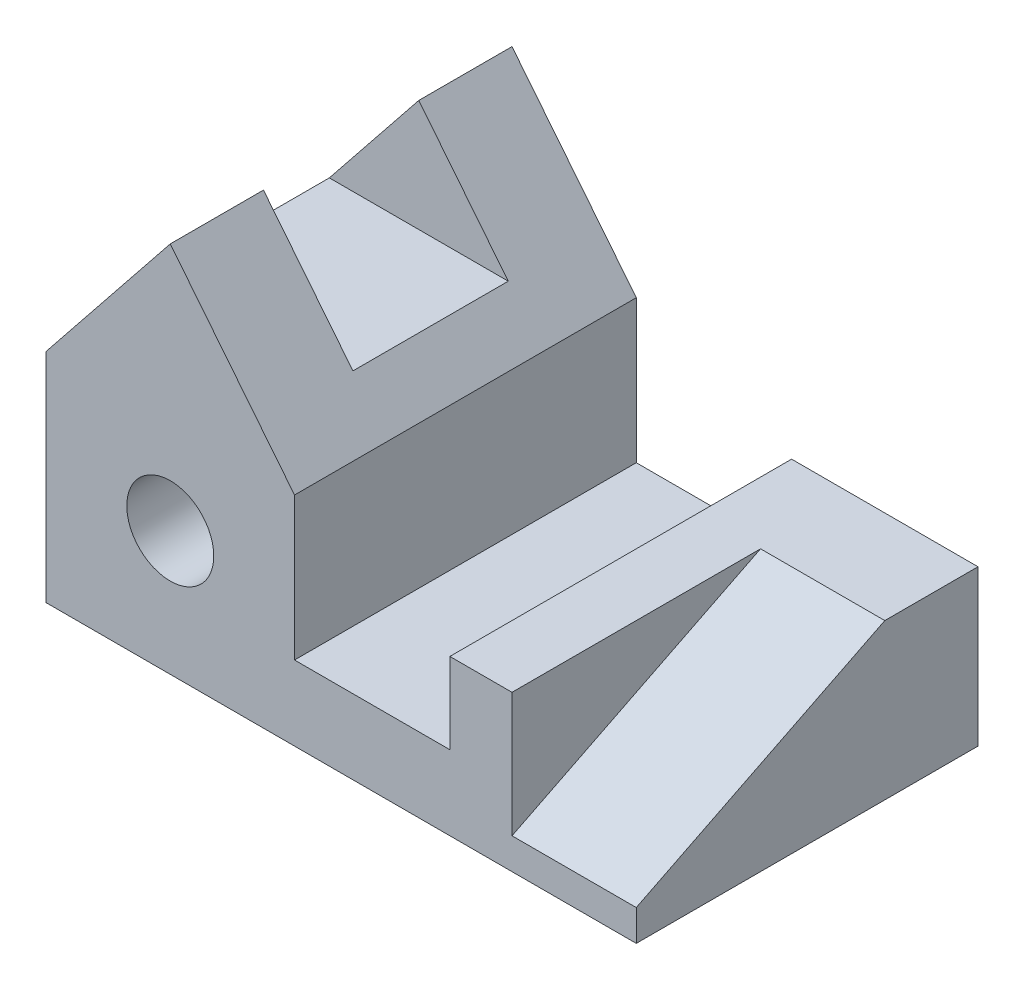
ISO-10303-21;
HEADER;
FILE_DESCRIPTION(('STEP AP214'),'2;1');
FILE_NAME('part.step','',(''),(''),'','','');
FILE_SCHEMA(('AUTOMOTIVE_DESIGN { 1 0 10303 214 1 1 1 1 }'));
ENDSEC;
DATA;
#1=APPLICATION_CONTEXT('core data for automotive mechanical design processes');
#2=APPLICATION_PROTOCOL_DEFINITION('international standard','automotive_design',2000,#1);
#3=PRODUCT_CONTEXT('',#1,'mechanical');
#4=PRODUCT('Part','Part','',(#3));
#5=PRODUCT_RELATED_PRODUCT_CATEGORY('part','',(#4));
#6=PRODUCT_DEFINITION_FORMATION('','',#4);
#7=PRODUCT_DEFINITION_CONTEXT('part definition',#1,'design');
#8=PRODUCT_DEFINITION('design','',#6,#7);
#9=PRODUCT_DEFINITION_SHAPE('','',#8);
#10=(LENGTH_UNIT() NAMED_UNIT(*) SI_UNIT(.MILLI.,.METRE.));
#11=(NAMED_UNIT(*) PLANE_ANGLE_UNIT() SI_UNIT($,.RADIAN.));
#12=(NAMED_UNIT(*) SI_UNIT($,.STERADIAN.) SOLID_ANGLE_UNIT());
#13=UNCERTAINTY_MEASURE_WITH_UNIT(LENGTH_MEASURE(1.E-05),#10,'distance_accuracy_value','');
#14=(GEOMETRIC_REPRESENTATION_CONTEXT(3) GLOBAL_UNCERTAINTY_ASSIGNED_CONTEXT((#13)) GLOBAL_UNIT_ASSIGNED_CONTEXT((#10,
#11,#12)) REPRESENTATION_CONTEXT('',''));
#15=CARTESIAN_POINT('',(0.,0.,0.));
#16=DIRECTION('',(0.,0.,1.));
#17=DIRECTION('',(1.,0.,0.));
#18=AXIS2_PLACEMENT_3D('',#15,#16,#17);
#19=CARTESIAN_POINT('',(8.93700412337291,1.25650559902534,-55.));
#20=DIRECTION('',(0.,-1.,0.));
#21=DIRECTION('',(1.,0.,0.));
#22=AXIS2_PLACEMENT_3D('',#19,#20,#21);
#23=PLANE('',#22);
#24=DIRECTION('',(1.,0.,0.));
#25=VECTOR('',#24,1.);
#26=CARTESIAN_POINT('',(8.93700412337291,1.25650559902534,0.));
#27=LINE('',#26,#25);
#28=CARTESIAN_POINT('',(-86.0629958766271,1.25650559902533,0.));
#29=VERTEX_POINT('',#28);
#30=CARTESIAN_POINT('',(8.93700412337291,1.25650559902534,0.));
#31=VERTEX_POINT('',#30);
#32=EDGE_CURVE('E205',#29,#31,#27,.T.);
#33=ORIENTED_EDGE('',*,*,#32,.F.);
#34=DIRECTION('',(0.,0.,1.));
#35=VECTOR('',#34,1.);
#36=CARTESIAN_POINT('',(-86.0629958766271,1.25650559902533,-55.));
#37=LINE('',#36,#35);
#38=CARTESIAN_POINT('',(-86.0629958766271,1.25650559902533,-55.));
#39=VERTEX_POINT('',#38);
#40=EDGE_CURVE('E11',#39,#29,#37,.T.);
#41=ORIENTED_EDGE('',*,*,#40,.F.);
#42=DIRECTION('',(1.,0.,0.));
#43=VECTOR('',#42,1.);
#44=CARTESIAN_POINT('',(8.93700412337291,1.25650559902534,-55.));
#45=LINE('',#44,#43);
#46=CARTESIAN_POINT('',(8.93700412337291,1.25650559902534,-55.));
#47=VERTEX_POINT('',#46);
#48=EDGE_CURVE('E209',#39,#47,#45,.T.);
#49=ORIENTED_EDGE('',*,*,#48,.T.);
#50=DIRECTION('',(0.,0.,1.));
#51=VECTOR('',#50,1.);
#52=CARTESIAN_POINT('',(8.93700412337291,1.25650559902534,-55.));
#53=LINE('',#52,#51);
#54=EDGE_CURVE('E42',#47,#31,#53,.T.);
#55=ORIENTED_EDGE('',*,*,#54,.T.);
#56=EDGE_LOOP('',(#33,#41,#49,#55));
#57=FACE_BOUND('',#56,.T.);
#58=ADVANCED_FACE('F39',(#57),#23,.T.);
#59=CARTESIAN_POINT('',(-86.0629958766271,1.25650559902533,-55.));
#60=DIRECTION('',(-1.,0.,0.));
#61=DIRECTION('',(0.,-1.,0.));
#62=AXIS2_PLACEMENT_3D('',#59,#60,#61);
#63=PLANE('',#62);
#64=DIRECTION('',(0.,-1.,0.));
#65=VECTOR('',#64,1.);
#66=CARTESIAN_POINT('',(-86.0629958766271,1.25650559902533,0.));
#67=LINE('',#66,#65);
#68=CARTESIAN_POINT('',(-86.0629958766271,36.2565055990253,0.));
#69=VERTEX_POINT('',#68);
#70=EDGE_CURVE('E214',#69,#29,#67,.T.);
#71=ORIENTED_EDGE('',*,*,#70,.F.);
#72=DIRECTION('',(0.,0.,1.));
#73=VECTOR('',#72,1.);
#74=CARTESIAN_POINT('',(-86.0629958766271,36.2565055990253,-55.));
#75=LINE('',#74,#73);
#76=CARTESIAN_POINT('',(-86.0629958766271,36.2565055990253,-55.));
#77=VERTEX_POINT('',#76);
#78=EDGE_CURVE('E48',#77,#69,#75,.T.);
#79=ORIENTED_EDGE('',*,*,#78,.F.);
#80=DIRECTION('',(0.,-1.,0.));
#81=VECTOR('',#80,1.);
#82=CARTESIAN_POINT('',(-86.0629958766271,1.25650559902533,-55.));
#83=LINE('',#82,#81);
#84=EDGE_CURVE('E242',#77,#39,#83,.T.);
#85=ORIENTED_EDGE('',*,*,#84,.T.);
#86=ORIENTED_EDGE('',*,*,#40,.T.);
#87=EDGE_LOOP('',(#71,#79,#85,#86));
#88=FACE_BOUND('',#87,.T.);
#89=ADVANCED_FACE('F308',(#88),#63,.T.);
#90=CARTESIAN_POINT('',(-86.0629958766271,36.2565055990253,-55.));
#91=DIRECTION('',(-0.780868809443031,0.624695047554424,0.));
#92=DIRECTION('',(-0.624695047554424,-0.78086880944303,0.));
#93=AXIS2_PLACEMENT_3D('',#90,#91,#92);
#94=PLANE('',#93);
#95=DIRECTION('',(-0.624695047554424,-0.78086880944303,0.));
#96=VECTOR('',#95,1.);
#97=CARTESIAN_POINT('',(-45.5748007546759,86.8667495014643,-15.));
#98=LINE('',#97,#96);
#99=CARTESIAN_POINT('',(-66.0629958766271,61.2565055990253,-15.));
#100=VERTEX_POINT('',#99);
#101=CARTESIAN_POINT('',(-80.4629958766271,43.2565055990253,-15.));
#102=VERTEX_POINT('',#101);
#103=EDGE_CURVE('E182',#100,#102,#98,.T.);
#104=ORIENTED_EDGE('',*,*,#103,.T.);
#105=DIRECTION('',(0.,0.,-1.));
#106=VECTOR('',#105,1.);
#107=CARTESIAN_POINT('',(-80.4629958766271,43.2565055990253,-40.));
#108=LINE('',#107,#106);
#109=CARTESIAN_POINT('',(-80.4629958766271,43.2565055990253,-40.));
#110=VERTEX_POINT('',#109);
#111=EDGE_CURVE('E178',#102,#110,#108,.T.);
#112=ORIENTED_EDGE('',*,*,#111,.T.);
#113=DIRECTION('',(0.624695047554424,0.78086880944303,0.));
#114=VECTOR('',#113,1.);
#115=CARTESIAN_POINT('',(-36.7943129497978,97.8423592575619,-40.));
#116=LINE('',#115,#114);
#117=CARTESIAN_POINT('',(-66.0629958766271,61.2565055990253,-40.));
#118=VERTEX_POINT('',#117);
#119=EDGE_CURVE('E196',#110,#118,#116,.T.);
#120=ORIENTED_EDGE('',*,*,#119,.T.);
#121=DIRECTION('',(0.,0.,1.));
#122=VECTOR('',#121,1.);
#123=CARTESIAN_POINT('',(-66.0629958766271,61.2565055990253,-55.));
#124=LINE('',#123,#122);
#125=CARTESIAN_POINT('',(-66.0629958766271,61.2565055990253,-55.));
#126=VERTEX_POINT('',#125);
#127=EDGE_CURVE('E278',#126,#118,#124,.T.);
#128=ORIENTED_EDGE('',*,*,#127,.F.);
#129=DIRECTION('',(-0.624695047554424,-0.78086880944303,0.));
#130=VECTOR('',#129,1.);
#131=CARTESIAN_POINT('',(-86.0629958766271,36.2565055990253,-55.));
#132=LINE('',#131,#130);
#133=EDGE_CURVE('E238',#126,#77,#132,.T.);
#134=ORIENTED_EDGE('',*,*,#133,.T.);
#135=ORIENTED_EDGE('',*,*,#78,.T.);
#136=DIRECTION('',(-0.624695047554424,-0.78086880944303,0.));
#137=VECTOR('',#136,1.);
#138=CARTESIAN_POINT('',(-86.0629958766271,36.2565055990253,0.));
#139=LINE('',#138,#137);
#140=CARTESIAN_POINT('',(-66.0629958766271,61.2565055990253,0.));
#141=VERTEX_POINT('',#140);
#142=EDGE_CURVE('E269',#141,#69,#139,.T.);
#143=ORIENTED_EDGE('',*,*,#142,.F.);
#144=EDGE_CURVE('E282',#100,#141,#124,.T.);
#145=ORIENTED_EDGE('',*,*,#144,.F.);
#146=EDGE_LOOP('',(#104,#112,#120,#128,#134,#135,#143,#145));
#147=FACE_BOUND('',#146,.T.);
#148=ADVANCED_FACE('F335',(#147),#94,.T.);
#149=CARTESIAN_POINT('',(-66.0629958766271,61.2565055990253,-55.));
#150=DIRECTION('',(0.78086880944303,0.624695047554424,0.));
#151=DIRECTION('',(-0.624695047554424,0.78086880944303,0.));
#152=AXIS2_PLACEMENT_3D('',#149,#150,#151);
#153=PLANE('',#152);
#154=DIRECTION('',(-0.624695047554424,0.78086880944303,0.));
#155=VECTOR('',#154,1.);
#156=CARTESIAN_POINT('',(-28.0138251449198,13.6950421843912,-15.));
#157=LINE('',#156,#155);
#158=CARTESIAN_POINT('',(-51.6629958766271,43.2565055990253,-15.));
#159=VERTEX_POINT('',#158);
#160=EDGE_CURVE('E174',#159,#100,#157,.T.);
#161=ORIENTED_EDGE('',*,*,#160,.T.);
#162=ORIENTED_EDGE('',*,*,#144,.T.);
#163=DIRECTION('',(-0.624695047554424,0.78086880944303,0.));
#164=VECTOR('',#163,1.);
#165=CARTESIAN_POINT('',(-66.0629958766271,61.2565055990253,0.));
#166=LINE('',#165,#164);
#167=CARTESIAN_POINT('',(-46.0629958766271,36.2565055990253,0.));
#168=VERTEX_POINT('',#167);
#169=EDGE_CURVE('E265',#168,#141,#166,.T.);
#170=ORIENTED_EDGE('',*,*,#169,.F.);
#171=DIRECTION('',(0.,0.,1.));
#172=VECTOR('',#171,1.);
#173=CARTESIAN_POINT('',(-46.0629958766271,36.2565055990253,-55.));
#174=LINE('',#173,#172);
#175=CARTESIAN_POINT('',(-46.0629958766271,36.2565055990253,-55.));
#176=VERTEX_POINT('',#175);
#177=EDGE_CURVE('E283',#176,#168,#174,.T.);
#178=ORIENTED_EDGE('',*,*,#177,.F.);
#179=DIRECTION('',(-0.624695047554424,0.78086880944303,0.));
#180=VECTOR('',#179,1.);
#181=CARTESIAN_POINT('',(-66.0629958766271,61.2565055990253,-55.));
#182=LINE('',#181,#180);
#183=EDGE_CURVE('E234',#176,#126,#182,.T.);
#184=ORIENTED_EDGE('',*,*,#183,.T.);
#185=ORIENTED_EDGE('',*,*,#127,.T.);
#186=DIRECTION('',(0.624695047554424,-0.78086880944303,0.));
#187=VECTOR('',#186,1.);
#188=CARTESIAN_POINT('',(-36.7943129497978,24.6706519404887,-40.));
#189=LINE('',#188,#187);
#190=CARTESIAN_POINT('',(-51.6629958766271,43.2565055990253,-40.));
#191=VERTEX_POINT('',#190);
#192=EDGE_CURVE('E190',#118,#191,#189,.T.);
#193=ORIENTED_EDGE('',*,*,#192,.T.);
#194=DIRECTION('',(0.,0.,1.));
#195=VECTOR('',#194,1.);
#196=CARTESIAN_POINT('',(-51.6629958766271,43.2565055990253,-40.));
#197=LINE('',#196,#195);
#198=EDGE_CURVE('E166',#191,#159,#197,.T.);
#199=ORIENTED_EDGE('',*,*,#198,.T.);
#200=EDGE_LOOP('',(#161,#162,#170,#178,#184,#185,#193,#199));
#201=FACE_BOUND('',#200,.T.);
#202=ADVANCED_FACE('F330',(#201),#153,.T.);
#203=CARTESIAN_POINT('',(-46.0629958766271,36.2565055990253,-55.));
#204=DIRECTION('',(1.,0.,0.));
#205=DIRECTION('',(0.,1.,0.));
#206=AXIS2_PLACEMENT_3D('',#203,#204,#205);
#207=PLANE('',#206);
#208=DIRECTION('',(0.,1.,0.));
#209=VECTOR('',#208,1.);
#210=CARTESIAN_POINT('',(-46.0629958766271,36.2565055990253,0.));
#211=LINE('',#210,#209);
#212=CARTESIAN_POINT('',(-46.0629958766271,13.2565055990253,0.));
#213=VERTEX_POINT('',#212);
#214=EDGE_CURVE('E261',#213,#168,#211,.T.);
#215=ORIENTED_EDGE('',*,*,#214,.F.);
#216=DIRECTION('',(0.,0.,1.));
#217=VECTOR('',#216,1.);
#218=CARTESIAN_POINT('',(-46.0629958766271,13.2565055990253,-55.));
#219=LINE('',#218,#217);
#220=CARTESIAN_POINT('',(-46.0629958766271,13.2565055990253,-55.));
#221=VERTEX_POINT('',#220);
#222=EDGE_CURVE('E286',#221,#213,#219,.T.);
#223=ORIENTED_EDGE('',*,*,#222,.F.);
#224=DIRECTION('',(0.,1.,0.));
#225=VECTOR('',#224,1.);
#226=CARTESIAN_POINT('',(-46.0629958766271,36.2565055990253,-55.));
#227=LINE('',#226,#225);
#228=EDGE_CURVE('E230',#221,#176,#227,.T.);
#229=ORIENTED_EDGE('',*,*,#228,.T.);
#230=ORIENTED_EDGE('',*,*,#177,.T.);
#231=EDGE_LOOP('',(#215,#223,#229,#230));
#232=FACE_BOUND('',#231,.T.);
#233=ADVANCED_FACE('F327',(#232),#207,.T.);
#234=CARTESIAN_POINT('',(-46.0629958766271,13.2565055990253,-55.));
#235=DIRECTION('',(0.,1.,0.));
#236=DIRECTION('',(-1.,0.,0.));
#237=AXIS2_PLACEMENT_3D('',#234,#235,#236);
#238=PLANE('',#237);
#239=DIRECTION('',(-1.,0.,0.));
#240=VECTOR('',#239,1.);
#241=CARTESIAN_POINT('',(-46.0629958766271,13.2565055990253,0.));
#242=LINE('',#241,#240);
#243=CARTESIAN_POINT('',(-21.0629958766271,13.2565055990253,0.));
#244=VERTEX_POINT('',#243);
#245=EDGE_CURVE('E257',#244,#213,#242,.T.);
#246=ORIENTED_EDGE('',*,*,#245,.F.);
#247=DIRECTION('',(0.,0.,1.));
#248=VECTOR('',#247,1.);
#249=CARTESIAN_POINT('',(-21.0629958766271,13.2565055990253,-55.));
#250=LINE('',#249,#248);
#251=CARTESIAN_POINT('',(-21.0629958766271,13.2565055990253,-55.));
#252=VERTEX_POINT('',#251);
#253=EDGE_CURVE('E289',#252,#244,#250,.T.);
#254=ORIENTED_EDGE('',*,*,#253,.F.);
#255=DIRECTION('',(-1.,0.,0.));
#256=VECTOR('',#255,1.);
#257=CARTESIAN_POINT('',(-46.0629958766271,13.2565055990253,-55.));
#258=LINE('',#257,#256);
#259=EDGE_CURVE('E226',#252,#221,#258,.T.);
#260=ORIENTED_EDGE('',*,*,#259,.T.);
#261=ORIENTED_EDGE('',*,*,#222,.T.);
#262=EDGE_LOOP('',(#246,#254,#260,#261));
#263=FACE_BOUND('',#262,.T.);
#264=ADVANCED_FACE('F323',(#263),#238,.T.);
#265=CARTESIAN_POINT('',(-21.0629958766271,13.2565055990253,-55.));
#266=DIRECTION('',(-1.,0.,0.));
#267=DIRECTION('',(0.,0.,1.));
#268=AXIS2_PLACEMENT_3D('',#265,#266,#267);
#269=PLANE('',#268);
#270=DIRECTION('',(0.,-1.,0.));
#271=VECTOR('',#270,1.);
#272=CARTESIAN_POINT('',(-21.0629958766271,13.2565055990253,0.));
#273=LINE('',#272,#271);
#274=CARTESIAN_POINT('',(-21.0629958766271,26.2565055990253,0.));
#275=VERTEX_POINT('',#274);
#276=EDGE_CURVE('E253',#275,#244,#273,.T.);
#277=ORIENTED_EDGE('',*,*,#276,.F.);
#278=DIRECTION('',(0.,0.,1.));
#279=VECTOR('',#278,1.);
#280=CARTESIAN_POINT('',(-21.0629958766271,26.2565055990253,-55.));
#281=LINE('',#280,#279);
#282=CARTESIAN_POINT('',(-21.0629958766271,26.2565055990253,-55.));
#283=VERTEX_POINT('',#282);
#284=EDGE_CURVE('E292',#283,#275,#281,.T.);
#285=ORIENTED_EDGE('',*,*,#284,.F.);
#286=DIRECTION('',(0.,-1.,0.));
#287=VECTOR('',#286,1.);
#288=CARTESIAN_POINT('',(-21.0629958766271,13.2565055990253,-55.));
#289=LINE('',#288,#287);
#290=EDGE_CURVE('E222',#283,#252,#289,.T.);
#291=ORIENTED_EDGE('',*,*,#290,.T.);
#292=ORIENTED_EDGE('',*,*,#253,.T.);
#293=EDGE_LOOP('',(#277,#285,#291,#292));
#294=FACE_BOUND('',#293,.T.);
#295=ADVANCED_FACE('F321',(#294),#269,.T.);
#296=CARTESIAN_POINT('',(-21.0629958766271,26.2565055990253,-55.));
#297=DIRECTION('',(0.,1.,0.));
#298=DIRECTION('',(-1.,0.,0.));
#299=AXIS2_PLACEMENT_3D('',#296,#297,#298);
#300=PLANE('',#299);
#301=DIRECTION('',(1.,0.,0.));
#302=VECTOR('',#301,1.);
#303=CARTESIAN_POINT('',(-11.0629958766271,26.2565055990253,-40.));
#304=LINE('',#303,#302);
#305=CARTESIAN_POINT('',(-11.0629958766271,26.2565055990253,-40.));
#306=VERTEX_POINT('',#305);
#307=CARTESIAN_POINT('',(8.93700412337291,26.2565055990253,-40.));
#308=VERTEX_POINT('',#307);
#309=EDGE_CURVE('E147',#306,#308,#304,.T.);
#310=ORIENTED_EDGE('',*,*,#309,.T.);
#311=DIRECTION('',(0.,0.,1.));
#312=VECTOR('',#311,1.);
#313=CARTESIAN_POINT('',(8.93700412337291,26.2565055990253,-55.));
#314=LINE('',#313,#312);
#315=CARTESIAN_POINT('',(8.93700412337291,26.2565055990253,-55.));
#316=VERTEX_POINT('',#315);
#317=EDGE_CURVE('E295',#316,#308,#314,.T.);
#318=ORIENTED_EDGE('',*,*,#317,.F.);
#319=DIRECTION('',(-1.,0.,0.));
#320=VECTOR('',#319,1.);
#321=CARTESIAN_POINT('',(-21.0629958766271,26.2565055990253,-55.));
#322=LINE('',#321,#320);
#323=EDGE_CURVE('E218',#316,#283,#322,.T.);
#324=ORIENTED_EDGE('',*,*,#323,.T.);
#325=ORIENTED_EDGE('',*,*,#284,.T.);
#326=DIRECTION('',(-1.,0.,0.));
#327=VECTOR('',#326,1.);
#328=CARTESIAN_POINT('',(-21.0629958766271,26.2565055990253,0.));
#329=LINE('',#328,#327);
#330=CARTESIAN_POINT('',(-11.0629958766271,26.2565055990253,0.));
#331=VERTEX_POINT('',#330);
#332=EDGE_CURVE('E250',#331,#275,#329,.T.);
#333=ORIENTED_EDGE('',*,*,#332,.F.);
#334=DIRECTION('',(0.,0.,1.));
#335=VECTOR('',#334,1.);
#336=CARTESIAN_POINT('',(-11.0629958766271,26.2565055990253,0.));
#337=LINE('',#336,#335);
#338=EDGE_CURVE('E56',#306,#331,#337,.T.);
#339=ORIENTED_EDGE('',*,*,#338,.F.);
#340=EDGE_LOOP('',(#310,#318,#324,#325,#333,#339));
#341=FACE_BOUND('',#340,.T.);
#342=ADVANCED_FACE('F317',(#341),#300,.T.);
#343=CARTESIAN_POINT('',(8.93700412337291,26.2565055990253,-55.));
#344=DIRECTION('',(1.,0.,0.));
#345=DIRECTION('',(0.,0.,-1.));
#346=AXIS2_PLACEMENT_3D('',#343,#344,#345);
#347=PLANE('',#346);
#348=DIRECTION('',(0.,0.447213595499958,-0.894427190999916));
#349=VECTOR('',#348,1.);
#350=CARTESIAN_POINT('',(8.93700412337291,6.25650559902534,0.));
#351=LINE('',#350,#349);
#352=CARTESIAN_POINT('',(8.93700412337291,6.25650559902534,0.));
#353=VERTEX_POINT('',#352);
#354=EDGE_CURVE('E155',#353,#308,#351,.T.);
#355=ORIENTED_EDGE('',*,*,#354,.F.);
#356=DIRECTION('',(0.,1.,0.));
#357=VECTOR('',#356,1.);
#358=CARTESIAN_POINT('',(8.93700412337291,26.2565055990253,0.));
#359=LINE('',#358,#357);
#360=EDGE_CURVE('E161',#31,#353,#359,.T.);
#361=ORIENTED_EDGE('',*,*,#360,.F.);
#362=ORIENTED_EDGE('',*,*,#54,.F.);
#363=DIRECTION('',(0.,1.,0.));
#364=VECTOR('',#363,1.);
#365=CARTESIAN_POINT('',(8.93700412337291,26.2565055990253,-55.));
#366=LINE('',#365,#364);
#367=EDGE_CURVE('E213',#47,#316,#366,.T.);
#368=ORIENTED_EDGE('',*,*,#367,.T.);
#369=ORIENTED_EDGE('',*,*,#317,.T.);
#370=EDGE_LOOP('',(#355,#361,#362,#368,#369));
#371=FACE_BOUND('',#370,.T.);
#372=ADVANCED_FACE('F304',(#371),#347,.T.);
#373=CARTESIAN_POINT('',(0.,0.,-55.));
#374=DIRECTION('',(0.,0.,-1.));
#375=DIRECTION('',(-1.,0.,0.));
#376=AXIS2_PLACEMENT_3D('',#373,#374,#375);
#377=PLANE('',#376);
#378=CARTESIAN_POINT('',(-66.0629958766271,21.2565055990253,-55.));
#379=DIRECTION('',(0.,0.,1.));
#380=DIRECTION('',(1.,0.,0.));
#381=AXIS2_PLACEMENT_3D('',#378,#379,#380);
#382=CIRCLE('',#381,7.);
#383=CARTESIAN_POINT('',(-59.0629958766271,21.2565055990253,-55.));
#384=VERTEX_POINT('',#383);
#385=EDGE_CURVE('E201',#384,#384,#382,.T.);
#386=ORIENTED_EDGE('',*,*,#385,.T.);
#387=EDGE_LOOP('',(#386));
#388=FACE_BOUND('',#387,.T.);
#389=ORIENTED_EDGE('',*,*,#48,.F.);
#390=ORIENTED_EDGE('',*,*,#84,.F.);
#391=ORIENTED_EDGE('',*,*,#133,.F.);
#392=ORIENTED_EDGE('',*,*,#183,.F.);
#393=ORIENTED_EDGE('',*,*,#228,.F.);
#394=ORIENTED_EDGE('',*,*,#259,.F.);
#395=ORIENTED_EDGE('',*,*,#290,.F.);
#396=ORIENTED_EDGE('',*,*,#323,.F.);
#397=ORIENTED_EDGE('',*,*,#367,.F.);
#398=EDGE_LOOP('',(#389,#390,#391,#392,#393,#394,#395,#396,#397));
#399=FACE_BOUND('',#398,.T.);
#400=ADVANCED_FACE('F311',(#388,#399),#377,.T.);
#401=CARTESIAN_POINT('',(0.,0.,0.));
#402=DIRECTION('',(0.,0.,-1.));
#403=DIRECTION('',(-1.,0.,0.));
#404=AXIS2_PLACEMENT_3D('',#401,#402,#403);
#405=PLANE('',#404);
#406=CARTESIAN_POINT('',(-66.0629958766271,21.2565055990253,0.));
#407=DIRECTION('',(0.,0.,1.));
#408=DIRECTION('',(1.,0.,0.));
#409=AXIS2_PLACEMENT_3D('',#406,#407,#408);
#410=CIRCLE('',#409,7.);
#411=CARTESIAN_POINT('',(-59.0629958766271,21.2565055990253,0.));
#412=VERTEX_POINT('',#411);
#413=EDGE_CURVE('E200',#412,#412,#410,.T.);
#414=ORIENTED_EDGE('',*,*,#413,.F.);
#415=EDGE_LOOP('',(#414));
#416=FACE_BOUND('',#415,.T.);
#417=ORIENTED_EDGE('',*,*,#360,.T.);
#418=DIRECTION('',(1.,0.,0.));
#419=VECTOR('',#418,1.);
#420=CARTESIAN_POINT('',(-11.0629958766271,6.25650559902534,0.));
#421=LINE('',#420,#419);
#422=CARTESIAN_POINT('',(-11.0629958766271,6.25650559902534,0.));
#423=VERTEX_POINT('',#422);
#424=EDGE_CURVE('E144',#423,#353,#421,.T.);
#425=ORIENTED_EDGE('',*,*,#424,.F.);
#426=DIRECTION('',(0.,-1.,0.));
#427=VECTOR('',#426,1.);
#428=CARTESIAN_POINT('',(-11.0629958766271,26.2565055990253,0.));
#429=LINE('',#428,#427);
#430=EDGE_CURVE('E149',#331,#423,#429,.T.);
#431=ORIENTED_EDGE('',*,*,#430,.F.);
#432=ORIENTED_EDGE('',*,*,#332,.T.);
#433=ORIENTED_EDGE('',*,*,#276,.T.);
#434=ORIENTED_EDGE('',*,*,#245,.T.);
#435=ORIENTED_EDGE('',*,*,#214,.T.);
#436=ORIENTED_EDGE('',*,*,#169,.T.);
#437=ORIENTED_EDGE('',*,*,#142,.T.);
#438=ORIENTED_EDGE('',*,*,#70,.T.);
#439=ORIENTED_EDGE('',*,*,#32,.T.);
#440=EDGE_LOOP('',(#417,#425,#431,#432,#433,#434,#435,#436,#437,#438,#439));
#441=FACE_BOUND('',#440,.T.);
#442=ADVANCED_FACE('F158',(#416,#441),#405,.F.);
#443=CARTESIAN_POINT('',(-66.0629958766271,21.2565055990253,-55.));
#444=DIRECTION('',(0.,0.,1.));
#445=DIRECTION('',(1.,0.,0.));
#446=AXIS2_PLACEMENT_3D('',#443,#444,#445);
#447=CYLINDRICAL_SURFACE('',#446,7.);
#448=ORIENTED_EDGE('',*,*,#385,.F.);
#449=EDGE_LOOP('',(#448));
#450=FACE_BOUND('',#449,.T.);
#451=ORIENTED_EDGE('',*,*,#413,.T.);
#452=EDGE_LOOP('',(#451));
#453=FACE_BOUND('',#452,.T.);
#454=ADVANCED_FACE('F343',(#450,#453),#447,.F.);
#455=CARTESIAN_POINT('',(8.93800412337292,43.2565055990253,-15.));
#456=DIRECTION('',(0.,0.,1.));
#457=DIRECTION('',(1.,0.,0.));
#458=AXIS2_PLACEMENT_3D('',#455,#456,#457);
#459=PLANE('',#458);
#460=ORIENTED_EDGE('',*,*,#160,.F.);
#461=DIRECTION('',(-1.,0.,0.));
#462=VECTOR('',#461,1.);
#463=CARTESIAN_POINT('',(8.93800412337292,43.2565055990253,-15.));
#464=LINE('',#463,#462);
#465=EDGE_CURVE('E186',#159,#102,#464,.T.);
#466=ORIENTED_EDGE('',*,*,#465,.T.);
#467=ORIENTED_EDGE('',*,*,#103,.F.);
#468=EDGE_LOOP('',(#460,#466,#467));
#469=FACE_BOUND('',#468,.T.);
#470=ADVANCED_FACE('F341',(#469),#459,.F.);
#471=CARTESIAN_POINT('',(8.93800412337292,43.2565055990253,-40.));
#472=DIRECTION('',(0.,-1.,0.));
#473=DIRECTION('',(1.,0.,0.));
#474=AXIS2_PLACEMENT_3D('',#471,#472,#473);
#475=PLANE('',#474);
#476=ORIENTED_EDGE('',*,*,#465,.F.);
#477=ORIENTED_EDGE('',*,*,#198,.F.);
#478=DIRECTION('',(-1.,0.,0.));
#479=VECTOR('',#478,1.);
#480=CARTESIAN_POINT('',(8.93800412337292,43.2565055990253,-40.));
#481=LINE('',#480,#479);
#482=EDGE_CURVE('E64',#191,#110,#481,.T.);
#483=ORIENTED_EDGE('',*,*,#482,.T.);
#484=ORIENTED_EDGE('',*,*,#111,.F.);
#485=EDGE_LOOP('',(#476,#477,#483,#484));
#486=FACE_BOUND('',#485,.T.);
#487=ADVANCED_FACE('F339',(#486),#475,.F.);
#488=CARTESIAN_POINT('',(8.93800412337294,61.2565055990253,-40.));
#489=DIRECTION('',(0.,0.,-1.));
#490=DIRECTION('',(-1.,0.,0.));
#491=AXIS2_PLACEMENT_3D('',#488,#489,#490);
#492=PLANE('',#491);
#493=ORIENTED_EDGE('',*,*,#482,.F.);
#494=ORIENTED_EDGE('',*,*,#192,.F.);
#495=ORIENTED_EDGE('',*,*,#119,.F.);
#496=EDGE_LOOP('',(#493,#494,#495));
#497=FACE_BOUND('',#496,.T.);
#498=ADVANCED_FACE('F336',(#497),#492,.F.);
#499=CARTESIAN_POINT('',(-11.0629958766271,6.25650559902534,0.));
#500=DIRECTION('',(0.,-0.894427190999916,-0.447213595499958));
#501=DIRECTION('',(0.,0.447213595499958,-0.894427190999916));
#502=AXIS2_PLACEMENT_3D('',#499,#500,#501);
#503=PLANE('',#502);
#504=ORIENTED_EDGE('',*,*,#354,.T.);
#505=ORIENTED_EDGE('',*,*,#309,.F.);
#506=DIRECTION('',(0.,0.447213595499958,-0.894427190999916));
#507=VECTOR('',#506,1.);
#508=CARTESIAN_POINT('',(-11.0629958766271,6.25650559902534,0.));
#509=LINE('',#508,#507);
#510=EDGE_CURVE('E141',#423,#306,#509,.T.);
#511=ORIENTED_EDGE('',*,*,#510,.F.);
#512=ORIENTED_EDGE('',*,*,#424,.T.);
#513=EDGE_LOOP('',(#504,#505,#511,#512));
#514=FACE_BOUND('',#513,.T.);
#515=ADVANCED_FACE('F142',(#514),#503,.F.);
#516=CARTESIAN_POINT('',(-11.0629958766271,0.,0.));
#517=DIRECTION('',(1.,0.,0.));
#518=DIRECTION('',(0.,0.,-1.));
#519=AXIS2_PLACEMENT_3D('',#516,#517,#518);
#520=PLANE('',#519);
#521=ORIENTED_EDGE('',*,*,#430,.T.);
#522=ORIENTED_EDGE('',*,*,#510,.T.);
#523=ORIENTED_EDGE('',*,*,#338,.T.);
#524=EDGE_LOOP('',(#521,#522,#523));
#525=FACE_BOUND('',#524,.T.);
#526=ADVANCED_FACE('F151',(#525),#520,.T.);
#527=CLOSED_SHELL('',(#58,#89,#148,#202,#233,#264,#295,#342,#372,#400,#442,#454,#470,#487,#498,
#515,#526));
#528=MANIFOLD_SOLID_BREP('B2',#527);
#529=ADVANCED_BREP_SHAPE_REPRESENTATION('',(#18,#528),#14);
#530=SHAPE_DEFINITION_REPRESENTATION(#9,#529);
ENDSEC;
END-ISO-10303-21;
